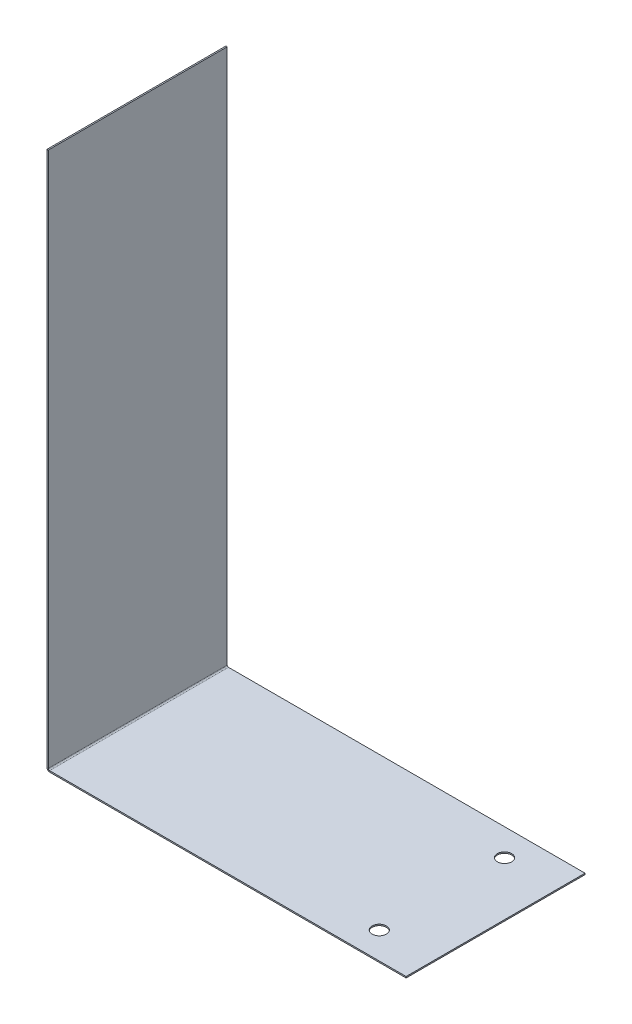
ISO-10303-21;
HEADER;
FILE_DESCRIPTION(('STEP AP214'),'2;1');
FILE_NAME('part.step','',(''),(''),'','','');
FILE_SCHEMA(('AUTOMOTIVE_DESIGN { 1 0 10303 214 1 1 1 1 }'));
ENDSEC;
DATA;
#1=APPLICATION_CONTEXT('core data for automotive mechanical design processes');
#2=APPLICATION_PROTOCOL_DEFINITION('international standard','automotive_design',2000,#1);
#3=PRODUCT_CONTEXT('',#1,'mechanical');
#4=PRODUCT('Part','Part','',(#3));
#5=PRODUCT_RELATED_PRODUCT_CATEGORY('part','',(#4));
#6=PRODUCT_DEFINITION_FORMATION('','',#4);
#7=PRODUCT_DEFINITION_CONTEXT('part definition',#1,'design');
#8=PRODUCT_DEFINITION('design','',#6,#7);
#9=PRODUCT_DEFINITION_SHAPE('','',#8);
#10=(LENGTH_UNIT() NAMED_UNIT(*) SI_UNIT(.MILLI.,.METRE.));
#11=(NAMED_UNIT(*) PLANE_ANGLE_UNIT() SI_UNIT($,.RADIAN.));
#12=(NAMED_UNIT(*) SI_UNIT($,.STERADIAN.) SOLID_ANGLE_UNIT());
#13=UNCERTAINTY_MEASURE_WITH_UNIT(LENGTH_MEASURE(1.E-05),#10,'distance_accuracy_value','');
#14=(GEOMETRIC_REPRESENTATION_CONTEXT(3) GLOBAL_UNCERTAINTY_ASSIGNED_CONTEXT((#13)) GLOBAL_UNIT_ASSIGNED_CONTEXT((#10,
#11,#12)) REPRESENTATION_CONTEXT('',''));
#15=CARTESIAN_POINT('',(0.,0.,0.));
#16=DIRECTION('',(0.,0.,1.));
#17=DIRECTION('',(1.,0.,0.));
#18=AXIS2_PLACEMENT_3D('',#15,#16,#17);
#19=CARTESIAN_POINT('',(0.7366,0.,100.));
#20=DIRECTION('',(0.,0.,1.));
#21=DIRECTION('',(1.,0.,0.));
#22=AXIS2_PLACEMENT_3D('',#19,#20,#21);
#23=PLANE('',#22);
#24=DIRECTION('',(0.,-1.,0.));
#25=VECTOR('',#24,1.);
#26=CARTESIAN_POINT('',(0.7366,0.,100.));
#27=LINE('',#26,#25);
#28=CARTESIAN_POINT('',(0.7366,0.,100.));
#29=VERTEX_POINT('',#28);
#30=CARTESIAN_POINT('',(0.7366,-0.7366,100.));
#31=VERTEX_POINT('',#30);
#32=EDGE_CURVE('E11',#29,#31,#27,.T.);
#33=ORIENTED_EDGE('',*,*,#32,.F.);
#34=CARTESIAN_POINT('',(0.7366,0.736599999999988,100.));
#35=DIRECTION('',(0.,0.,-1.));
#36=DIRECTION('',(-1.,0.,0.));
#37=AXIS2_PLACEMENT_3D('',#34,#35,#36);
#38=CIRCLE('',#37,0.7366);
#39=CARTESIAN_POINT('',(0.,0.736599999999976,100.));
#40=VERTEX_POINT('',#39);
#41=EDGE_CURVE('E135',#40,#29,#38,.F.);
#42=ORIENTED_EDGE('',*,*,#41,.F.);
#43=DIRECTION('',(1.,0.,0.));
#44=VECTOR('',#43,1.);
#45=CARTESIAN_POINT('',(-0.7366,0.736599999999965,100.));
#46=LINE('',#45,#44);
#47=CARTESIAN_POINT('',(-0.7366,0.736599999999965,100.));
#48=VERTEX_POINT('',#47);
#49=EDGE_CURVE('E46',#48,#40,#46,.T.);
#50=ORIENTED_EDGE('',*,*,#49,.F.);
#51=CARTESIAN_POINT('',(0.7366,0.736599999999988,100.));
#52=DIRECTION('',(0.,0.,1.));
#53=DIRECTION('',(1.,0.,0.));
#54=AXIS2_PLACEMENT_3D('',#51,#52,#53);
#55=CIRCLE('',#54,1.4732);
#56=EDGE_CURVE('E128',#48,#31,#55,.T.);
#57=ORIENTED_EDGE('',*,*,#56,.T.);
#58=EDGE_LOOP('',(#33,#42,#50,#57));
#59=FACE_BOUND('',#58,.T.);
#60=ADVANCED_FACE('F38',(#59),#23,.T.);
#61=CARTESIAN_POINT('',(-0.7366,0.736599999999965,100.));
#62=DIRECTION('',(0.,0.,1.));
#63=DIRECTION('',(1.,0.,0.));
#64=AXIS2_PLACEMENT_3D('',#61,#62,#63);
#65=PLANE('',#64);
#66=DIRECTION('',(1.,0.,0.));
#67=VECTOR('',#66,1.);
#68=CARTESIAN_POINT('',(0.,0.,100.));
#69=LINE('',#68,#67);
#70=CARTESIAN_POINT('',(200.,0.,100.));
#71=VERTEX_POINT('',#70);
#72=EDGE_CURVE('E185',#29,#71,#69,.T.);
#73=ORIENTED_EDGE('',*,*,#72,.F.);
#74=ORIENTED_EDGE('',*,*,#32,.T.);
#75=DIRECTION('',(1.,0.,0.));
#76=VECTOR('',#75,1.);
#77=CARTESIAN_POINT('',(0.,-0.7366,100.));
#78=LINE('',#77,#76);
#79=CARTESIAN_POINT('',(200.,-0.7366,100.));
#80=VERTEX_POINT('',#79);
#81=EDGE_CURVE('E94',#31,#80,#78,.T.);
#82=ORIENTED_EDGE('',*,*,#81,.T.);
#83=DIRECTION('',(0.,-1.,0.));
#84=VECTOR('',#83,1.);
#85=CARTESIAN_POINT('',(200.,0.,100.));
#86=LINE('',#85,#84);
#87=EDGE_CURVE('E379',#71,#80,#86,.T.);
#88=ORIENTED_EDGE('',*,*,#87,.F.);
#89=EDGE_LOOP('',(#73,#74,#82,#88));
#90=FACE_BOUND('',#89,.T.);
#91=ADVANCED_FACE('F193',(#90),#65,.T.);
#92=CARTESIAN_POINT('',(0.,0.736599999999976,0.));
#93=DIRECTION('',(0.,0.,-1.));
#94=DIRECTION('',(-1.,0.,0.));
#95=AXIS2_PLACEMENT_3D('',#92,#93,#94);
#96=PLANE('',#95);
#97=DIRECTION('',(-1.,0.,0.));
#98=VECTOR('',#97,1.);
#99=CARTESIAN_POINT('',(0.,0.736599999999976,0.));
#100=LINE('',#99,#98);
#101=CARTESIAN_POINT('',(0.,0.736599999999976,0.));
#102=VERTEX_POINT('',#101);
#103=CARTESIAN_POINT('',(-0.7366,0.736599999999965,0.));
#104=VERTEX_POINT('',#103);
#105=EDGE_CURVE('E81',#102,#104,#100,.T.);
#106=ORIENTED_EDGE('',*,*,#105,.F.);
#107=CARTESIAN_POINT('',(0.7366,0.736599999999988,0.));
#108=DIRECTION('',(0.,0.,-1.));
#109=DIRECTION('',(-1.,0.,0.));
#110=AXIS2_PLACEMENT_3D('',#107,#108,#109);
#111=CIRCLE('',#110,0.7366);
#112=CARTESIAN_POINT('',(0.7366,0.,0.));
#113=VERTEX_POINT('',#112);
#114=EDGE_CURVE('E151',#102,#113,#111,.F.);
#115=ORIENTED_EDGE('',*,*,#114,.T.);
#116=DIRECTION('',(0.,1.,0.));
#117=VECTOR('',#116,1.);
#118=CARTESIAN_POINT('',(0.7366,-0.7366,0.));
#119=LINE('',#118,#117);
#120=CARTESIAN_POINT('',(0.7366,-0.7366,0.));
#121=VERTEX_POINT('',#120);
#122=EDGE_CURVE('E88',#121,#113,#119,.T.);
#123=ORIENTED_EDGE('',*,*,#122,.F.);
#124=CARTESIAN_POINT('',(0.7366,0.736599999999988,0.));
#125=DIRECTION('',(0.,0.,1.));
#126=DIRECTION('',(1.,0.,0.));
#127=AXIS2_PLACEMENT_3D('',#124,#125,#126);
#128=CIRCLE('',#127,1.4732);
#129=EDGE_CURVE('E158',#104,#121,#128,.T.);
#130=ORIENTED_EDGE('',*,*,#129,.F.);
#131=EDGE_LOOP('',(#106,#115,#123,#130));
#132=FACE_BOUND('',#131,.T.);
#133=ADVANCED_FACE('F191',(#132),#96,.T.);
#134=CARTESIAN_POINT('',(0.7366,-0.7366,0.));
#135=DIRECTION('',(0.,0.,-1.));
#136=DIRECTION('',(-1.,0.,0.));
#137=AXIS2_PLACEMENT_3D('',#134,#135,#136);
#138=PLANE('',#137);
#139=DIRECTION('',(0.,-1.,0.));
#140=VECTOR('',#139,1.);
#141=CARTESIAN_POINT('',(0.,300.,0.));
#142=LINE('',#141,#140);
#143=CARTESIAN_POINT('',(0.,300.,0.));
#144=VERTEX_POINT('',#143);
#145=EDGE_CURVE('E153',#144,#102,#142,.T.);
#146=ORIENTED_EDGE('',*,*,#145,.T.);
#147=ORIENTED_EDGE('',*,*,#105,.T.);
#148=DIRECTION('',(0.,-1.,0.));
#149=VECTOR('',#148,1.);
#150=CARTESIAN_POINT('',(-0.736599999999994,300.,0.));
#151=LINE('',#150,#149);
#152=CARTESIAN_POINT('',(-0.736599999999994,300.,0.));
#153=VERTEX_POINT('',#152);
#154=EDGE_CURVE('E156',#153,#104,#151,.T.);
#155=ORIENTED_EDGE('',*,*,#154,.F.);
#156=DIRECTION('',(1.,0.,0.));
#157=VECTOR('',#156,1.);
#158=CARTESIAN_POINT('',(-0.736599999999994,300.,0.));
#159=LINE('',#158,#157);
#160=EDGE_CURVE('E116',#153,#144,#159,.T.);
#161=ORIENTED_EDGE('',*,*,#160,.T.);
#162=EDGE_LOOP('',(#146,#147,#155,#161));
#163=FACE_BOUND('',#162,.T.);
#164=ADVANCED_FACE('F187',(#163),#138,.T.);
#165=CARTESIAN_POINT('',(0.,-0.7366,100.));
#166=DIRECTION('',(0.,1.,0.));
#167=DIRECTION('',(0.,0.,1.));
#168=AXIS2_PLACEMENT_3D('',#165,#166,#167);
#169=PLANE('',#168);
#170=CARTESIAN_POINT('',(170.,-0.7366,85.));
#171=DIRECTION('',(0.,1.,0.));
#172=DIRECTION('',(0.,0.,1.));
#173=AXIS2_PLACEMENT_3D('',#170,#171,#172);
#174=CIRCLE('',#173,3.99999999999999);
#175=CARTESIAN_POINT('',(170.,-0.7366,89.));
#176=VERTEX_POINT('',#175);
#177=EDGE_CURVE('E369',#176,#176,#174,.T.);
#178=ORIENTED_EDGE('',*,*,#177,.T.);
#179=EDGE_LOOP('',(#178));
#180=FACE_BOUND('',#179,.T.);
#181=CARTESIAN_POINT('',(170.,-0.7366,15.));
#182=DIRECTION('',(0.,1.,0.));
#183=DIRECTION('',(0.,0.,1.));
#184=AXIS2_PLACEMENT_3D('',#181,#182,#183);
#185=CIRCLE('',#184,3.99999999999999);
#186=CARTESIAN_POINT('',(170.,-0.7366,19.));
#187=VERTEX_POINT('',#186);
#188=EDGE_CURVE('E145',#187,#187,#185,.T.);
#189=ORIENTED_EDGE('',*,*,#188,.T.);
#190=EDGE_LOOP('',(#189));
#191=FACE_BOUND('',#190,.T.);
#192=DIRECTION('',(1.,0.,0.));
#193=VECTOR('',#192,1.);
#194=CARTESIAN_POINT('',(0.,-0.7366,0.));
#195=LINE('',#194,#193);
#196=CARTESIAN_POINT('',(200.,-0.7366,0.));
#197=VERTEX_POINT('',#196);
#198=EDGE_CURVE('E141',#121,#197,#195,.T.);
#199=ORIENTED_EDGE('',*,*,#198,.T.);
#200=DIRECTION('',(0.,0.,-1.));
#201=VECTOR('',#200,1.);
#202=CARTESIAN_POINT('',(200.,-0.7366,100.));
#203=LINE('',#202,#201);
#204=EDGE_CURVE('E172',#80,#197,#203,.T.);
#205=ORIENTED_EDGE('',*,*,#204,.F.);
#206=ORIENTED_EDGE('',*,*,#81,.F.);
#207=DIRECTION('',(0.,0.,-1.));
#208=VECTOR('',#207,1.);
#209=CARTESIAN_POINT('',(0.7366,-0.7366,100.));
#210=LINE('',#209,#208);
#211=EDGE_CURVE('E140',#31,#121,#210,.T.);
#212=ORIENTED_EDGE('',*,*,#211,.T.);
#213=EDGE_LOOP('',(#199,#205,#206,#212));
#214=FACE_BOUND('',#213,.T.);
#215=ADVANCED_FACE('F199',(#180,#191,#214),#169,.F.);
#216=CARTESIAN_POINT('',(200.,0.,100.));
#217=DIRECTION('',(1.,0.,0.));
#218=DIRECTION('',(0.,0.,-1.));
#219=AXIS2_PLACEMENT_3D('',#216,#217,#218);
#220=PLANE('',#219);
#221=DIRECTION('',(0.,-1.,0.));
#222=VECTOR('',#221,1.);
#223=CARTESIAN_POINT('',(200.,0.,0.));
#224=LINE('',#223,#222);
#225=CARTESIAN_POINT('',(200.,0.,0.));
#226=VERTEX_POINT('',#225);
#227=EDGE_CURVE('E144',#226,#197,#224,.T.);
#228=ORIENTED_EDGE('',*,*,#227,.F.);
#229=DIRECTION('',(0.,0.,-1.));
#230=VECTOR('',#229,1.);
#231=CARTESIAN_POINT('',(200.,0.,100.));
#232=LINE('',#231,#230);
#233=EDGE_CURVE('E170',#71,#226,#232,.T.);
#234=ORIENTED_EDGE('',*,*,#233,.F.);
#235=ORIENTED_EDGE('',*,*,#87,.T.);
#236=ORIENTED_EDGE('',*,*,#204,.T.);
#237=EDGE_LOOP('',(#228,#234,#235,#236));
#238=FACE_BOUND('',#237,.T.);
#239=ADVANCED_FACE('F228',(#238),#220,.T.);
#240=CARTESIAN_POINT('',(0.,0.,100.));
#241=DIRECTION('',(0.,1.,0.));
#242=DIRECTION('',(0.,0.,1.));
#243=AXIS2_PLACEMENT_3D('',#240,#241,#242);
#244=PLANE('',#243);
#245=CARTESIAN_POINT('',(170.,0.,85.));
#246=DIRECTION('',(0.,1.,0.));
#247=DIRECTION('',(0.,0.,-1.));
#248=AXIS2_PLACEMENT_3D('',#245,#246,#247);
#249=CIRCLE('',#248,3.99999999999999);
#250=CARTESIAN_POINT('',(170.,0.,81.));
#251=VERTEX_POINT('',#250);
#252=EDGE_CURVE('E366',#251,#251,#249,.T.);
#253=ORIENTED_EDGE('',*,*,#252,.F.);
#254=EDGE_LOOP('',(#253));
#255=FACE_BOUND('',#254,.T.);
#256=CARTESIAN_POINT('',(170.,0.,15.));
#257=DIRECTION('',(0.,1.,0.));
#258=DIRECTION('',(0.,0.,1.));
#259=AXIS2_PLACEMENT_3D('',#256,#257,#258);
#260=CIRCLE('',#259,3.99999999999999);
#261=CARTESIAN_POINT('',(170.,0.,19.));
#262=VERTEX_POINT('',#261);
#263=EDGE_CURVE('E370',#262,#262,#260,.T.);
#264=ORIENTED_EDGE('',*,*,#263,.F.);
#265=EDGE_LOOP('',(#264));
#266=FACE_BOUND('',#265,.T.);
#267=DIRECTION('',(1.,0.,0.));
#268=VECTOR('',#267,1.);
#269=CARTESIAN_POINT('',(0.,0.,0.));
#270=LINE('',#269,#268);
#271=EDGE_CURVE('E148',#113,#226,#270,.T.);
#272=ORIENTED_EDGE('',*,*,#271,.F.);
#273=DIRECTION('',(0.,0.,-1.));
#274=VECTOR('',#273,1.);
#275=CARTESIAN_POINT('',(0.7366,0.,100.));
#276=LINE('',#275,#274);
#277=EDGE_CURVE('E167',#29,#113,#276,.T.);
#278=ORIENTED_EDGE('',*,*,#277,.F.);
#279=ORIENTED_EDGE('',*,*,#72,.T.);
#280=ORIENTED_EDGE('',*,*,#233,.T.);
#281=EDGE_LOOP('',(#272,#278,#279,#280));
#282=FACE_BOUND('',#281,.T.);
#283=ADVANCED_FACE('F233',(#255,#266,#282),#244,.T.);
#284=CARTESIAN_POINT('',(0.7366,0.736599999999988,100.));
#285=DIRECTION('',(0.,0.,-1.));
#286=DIRECTION('',(-1.,0.,0.));
#287=AXIS2_PLACEMENT_3D('',#284,#285,#286);
#288=CYLINDRICAL_SURFACE('',#287,0.7366);
#289=ORIENTED_EDGE('',*,*,#114,.F.);
#290=DIRECTION('',(0.,0.,-1.));
#291=VECTOR('',#290,1.);
#292=CARTESIAN_POINT('',(0.,0.736599999999976,100.));
#293=LINE('',#292,#291);
#294=EDGE_CURVE('E164',#40,#102,#293,.T.);
#295=ORIENTED_EDGE('',*,*,#294,.F.);
#296=ORIENTED_EDGE('',*,*,#41,.T.);
#297=ORIENTED_EDGE('',*,*,#277,.T.);
#298=EDGE_LOOP('',(#289,#295,#296,#297));
#299=FACE_BOUND('',#298,.T.);
#300=ADVANCED_FACE('F181',(#299),#288,.F.);
#301=CARTESIAN_POINT('',(0.,300.,100.));
#302=DIRECTION('',(1.,0.,0.));
#303=DIRECTION('',(0.,1.,0.));
#304=AXIS2_PLACEMENT_3D('',#301,#302,#303);
#305=PLANE('',#304);
#306=ORIENTED_EDGE('',*,*,#145,.F.);
#307=DIRECTION('',(0.,0.,-1.));
#308=VECTOR('',#307,1.);
#309=CARTESIAN_POINT('',(0.,300.,100.));
#310=LINE('',#309,#308);
#311=CARTESIAN_POINT('',(0.,300.,100.));
#312=VERTEX_POINT('',#311);
#313=EDGE_CURVE('E118',#312,#144,#310,.T.);
#314=ORIENTED_EDGE('',*,*,#313,.F.);
#315=DIRECTION('',(0.,-1.,0.));
#316=VECTOR('',#315,1.);
#317=CARTESIAN_POINT('',(0.,300.,100.));
#318=LINE('',#317,#316);
#319=EDGE_CURVE('E133',#312,#40,#318,.T.);
#320=ORIENTED_EDGE('',*,*,#319,.T.);
#321=ORIENTED_EDGE('',*,*,#294,.T.);
#322=EDGE_LOOP('',(#306,#314,#320,#321));
#323=FACE_BOUND('',#322,.T.);
#324=ADVANCED_FACE('F186',(#323),#305,.T.);
#325=CARTESIAN_POINT('',(-0.736599999999994,300.,100.));
#326=DIRECTION('',(0.,1.,0.));
#327=DIRECTION('',(0.,0.,1.));
#328=AXIS2_PLACEMENT_3D('',#325,#326,#327);
#329=PLANE('',#328);
#330=ORIENTED_EDGE('',*,*,#160,.F.);
#331=DIRECTION('',(0.,0.,-1.));
#332=VECTOR('',#331,1.);
#333=CARTESIAN_POINT('',(-0.736599999999994,300.,100.));
#334=LINE('',#333,#332);
#335=CARTESIAN_POINT('',(-0.736599999999994,300.,100.));
#336=VERTEX_POINT('',#335);
#337=EDGE_CURVE('E110',#336,#153,#334,.T.);
#338=ORIENTED_EDGE('',*,*,#337,.F.);
#339=DIRECTION('',(1.,0.,0.));
#340=VECTOR('',#339,1.);
#341=CARTESIAN_POINT('',(-0.736599999999994,300.,100.));
#342=LINE('',#341,#340);
#343=EDGE_CURVE('E114',#336,#312,#342,.T.);
#344=ORIENTED_EDGE('',*,*,#343,.T.);
#345=ORIENTED_EDGE('',*,*,#313,.T.);
#346=EDGE_LOOP('',(#330,#338,#344,#345));
#347=FACE_BOUND('',#346,.T.);
#348=ADVANCED_FACE('F112',(#347),#329,.T.);
#349=CARTESIAN_POINT('',(-0.736599999999994,300.,100.));
#350=DIRECTION('',(1.,0.,0.));
#351=DIRECTION('',(0.,1.,0.));
#352=AXIS2_PLACEMENT_3D('',#349,#350,#351);
#353=PLANE('',#352);
#354=ORIENTED_EDGE('',*,*,#154,.T.);
#355=DIRECTION('',(0.,0.,-1.));
#356=VECTOR('',#355,1.);
#357=CARTESIAN_POINT('',(-0.7366,0.736599999999965,100.));
#358=LINE('',#357,#356);
#359=EDGE_CURVE('E119',#48,#104,#358,.T.);
#360=ORIENTED_EDGE('',*,*,#359,.F.);
#361=DIRECTION('',(0.,-1.,0.));
#362=VECTOR('',#361,1.);
#363=CARTESIAN_POINT('',(-0.736599999999994,300.,100.));
#364=LINE('',#363,#362);
#365=EDGE_CURVE('E123',#336,#48,#364,.T.);
#366=ORIENTED_EDGE('',*,*,#365,.F.);
#367=ORIENTED_EDGE('',*,*,#337,.T.);
#368=EDGE_LOOP('',(#354,#360,#366,#367));
#369=FACE_BOUND('',#368,.T.);
#370=ADVANCED_FACE('F124',(#369),#353,.F.);
#371=CARTESIAN_POINT('',(0.7366,0.736599999999988,100.));
#372=DIRECTION('',(0.,0.,-1.));
#373=DIRECTION('',(-1.,0.,0.));
#374=AXIS2_PLACEMENT_3D('',#371,#372,#373);
#375=CYLINDRICAL_SURFACE('',#374,1.4732);
#376=ORIENTED_EDGE('',*,*,#129,.T.);
#377=ORIENTED_EDGE('',*,*,#211,.F.);
#378=ORIENTED_EDGE('',*,*,#56,.F.);
#379=ORIENTED_EDGE('',*,*,#359,.T.);
#380=EDGE_LOOP('',(#376,#377,#378,#379));
#381=FACE_BOUND('',#380,.T.);
#382=ADVANCED_FACE('F189',(#381),#375,.T.);
#383=CARTESIAN_POINT('',(0.7366,0.736599999999988,100.));
#384=DIRECTION('',(0.,0.,-1.));
#385=DIRECTION('',(-1.,0.,0.));
#386=AXIS2_PLACEMENT_3D('',#383,#384,#385);
#387=PLANE('',#386);
#388=ORIENTED_EDGE('',*,*,#365,.T.);
#389=ORIENTED_EDGE('',*,*,#49,.T.);
#390=ORIENTED_EDGE('',*,*,#319,.F.);
#391=ORIENTED_EDGE('',*,*,#343,.F.);
#392=EDGE_LOOP('',(#388,#389,#390,#391));
#393=FACE_BOUND('',#392,.T.);
#394=ADVANCED_FACE('F131',(#393),#387,.F.);
#395=CARTESIAN_POINT('',(0.7366,0.736599999999988,0.));
#396=DIRECTION('',(0.,0.,-1.));
#397=DIRECTION('',(-1.,0.,0.));
#398=AXIS2_PLACEMENT_3D('',#395,#396,#397);
#399=PLANE('',#398);
#400=ORIENTED_EDGE('',*,*,#198,.F.);
#401=ORIENTED_EDGE('',*,*,#122,.T.);
#402=ORIENTED_EDGE('',*,*,#271,.T.);
#403=ORIENTED_EDGE('',*,*,#227,.T.);
#404=EDGE_LOOP('',(#400,#401,#402,#403));
#405=FACE_BOUND('',#404,.T.);
#406=ADVANCED_FACE('F291',(#405),#399,.T.);
#407=CARTESIAN_POINT('',(170.,-10.,15.));
#408=DIRECTION('',(0.,1.,0.));
#409=DIRECTION('',(0.,0.,1.));
#410=AXIS2_PLACEMENT_3D('',#407,#408,#409);
#411=CYLINDRICAL_SURFACE('',#410,3.99999999999999);
#412=ORIENTED_EDGE('',*,*,#263,.T.);
#413=EDGE_LOOP('',(#412));
#414=FACE_BOUND('',#413,.T.);
#415=ORIENTED_EDGE('',*,*,#188,.F.);
#416=EDGE_LOOP('',(#415));
#417=FACE_BOUND('',#416,.T.);
#418=ADVANCED_FACE('F301',(#414,#417),#411,.F.);
#419=CARTESIAN_POINT('',(170.,-10.,85.));
#420=DIRECTION('',(0.,1.,0.));
#421=DIRECTION('',(0.,0.,1.));
#422=AXIS2_PLACEMENT_3D('',#419,#420,#421);
#423=CYLINDRICAL_SURFACE('',#422,3.99999999999999);
#424=ORIENTED_EDGE('',*,*,#252,.T.);
#425=EDGE_LOOP('',(#424));
#426=FACE_BOUND('',#425,.T.);
#427=ORIENTED_EDGE('',*,*,#177,.F.);
#428=EDGE_LOOP('',(#427));
#429=FACE_BOUND('',#428,.T.);
#430=ADVANCED_FACE('F328',(#426,#429),#423,.F.);
#431=CLOSED_SHELL('',(#60,#91,#133,#164,#215,#239,#283,#300,#324,#348,#370,#382,#394,#406,#418,#430));
#432=MANIFOLD_SOLID_BREP('B2',#431);
#433=ADVANCED_BREP_SHAPE_REPRESENTATION('',(#18,#432),#14);
#434=SHAPE_DEFINITION_REPRESENTATION(#9,#433);
ENDSEC;
END-ISO-10303-21;
